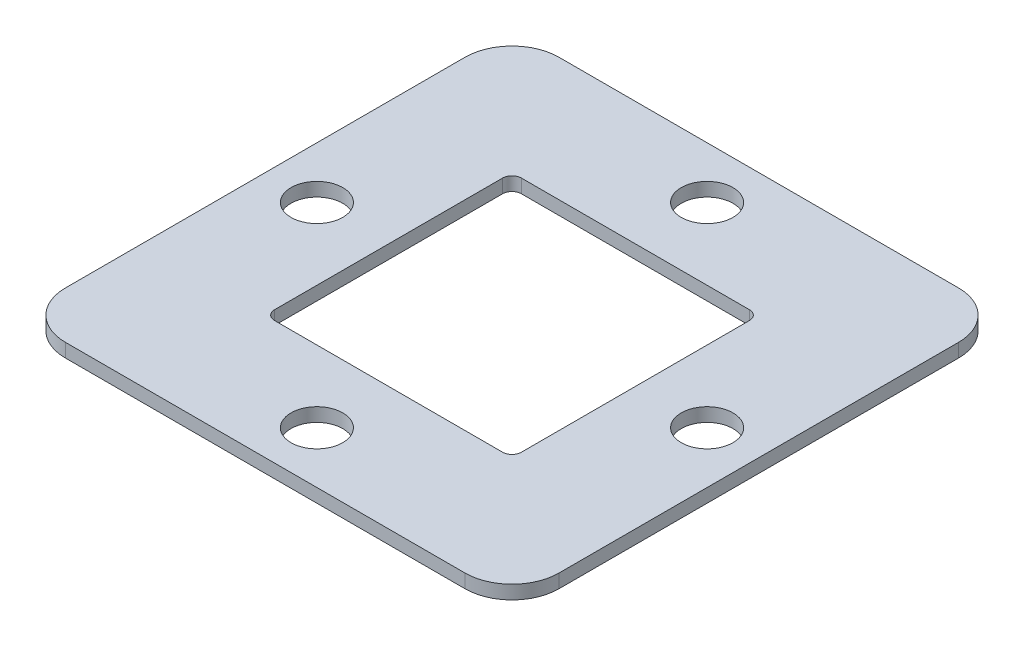
ISO-10303-21;
HEADER;
FILE_DESCRIPTION(('STEP AP214'),'2;1');
FILE_NAME('part.step','',(''),(''),'','','');
FILE_SCHEMA(('AUTOMOTIVE_DESIGN { 1 0 10303 214 1 1 1 1 }'));
ENDSEC;
DATA;
#1=APPLICATION_CONTEXT('core data for automotive mechanical design processes');
#2=APPLICATION_PROTOCOL_DEFINITION('international standard','automotive_design',2000,#1);
#3=PRODUCT_CONTEXT('',#1,'mechanical');
#4=PRODUCT('Part','Part','',(#3));
#5=PRODUCT_RELATED_PRODUCT_CATEGORY('part','',(#4));
#6=PRODUCT_DEFINITION_FORMATION('','',#4);
#7=PRODUCT_DEFINITION_CONTEXT('part definition',#1,'design');
#8=PRODUCT_DEFINITION('design','',#6,#7);
#9=PRODUCT_DEFINITION_SHAPE('','',#8);
#10=(LENGTH_UNIT() NAMED_UNIT(*) SI_UNIT(.MILLI.,.METRE.));
#11=(NAMED_UNIT(*) PLANE_ANGLE_UNIT() SI_UNIT($,.RADIAN.));
#12=(NAMED_UNIT(*) SI_UNIT($,.STERADIAN.) SOLID_ANGLE_UNIT());
#13=UNCERTAINTY_MEASURE_WITH_UNIT(LENGTH_MEASURE(1.E-05),#10,'distance_accuracy_value','');
#14=(GEOMETRIC_REPRESENTATION_CONTEXT(3) GLOBAL_UNCERTAINTY_ASSIGNED_CONTEXT((#13)) GLOBAL_UNIT_ASSIGNED_CONTEXT((#10,
#11,#12)) REPRESENTATION_CONTEXT('',''));
#15=CARTESIAN_POINT('',(0.,0.,0.));
#16=DIRECTION('',(0.,0.,1.));
#17=DIRECTION('',(1.,0.,0.));
#18=AXIS2_PLACEMENT_3D('',#15,#16,#17);
#19=CARTESIAN_POINT('',(10.5,0.58,-10.5));
#20=DIRECTION('',(-1.,0.,0.));
#21=DIRECTION('',(0.,0.,1.));
#22=AXIS2_PLACEMENT_3D('',#19,#20,#21);
#23=PLANE('',#22);
#24=DIRECTION('',(0.,0.,-1.));
#25=VECTOR('',#24,1.);
#26=CARTESIAN_POINT('',(10.5,0.,-10.5));
#27=LINE('',#26,#25);
#28=CARTESIAN_POINT('',(10.5,0.,8.5));
#29=VERTEX_POINT('',#28);
#30=CARTESIAN_POINT('',(10.5,0.,-8.5));
#31=VERTEX_POINT('',#30);
#32=EDGE_CURVE('E271',#29,#31,#27,.T.);
#33=ORIENTED_EDGE('',*,*,#32,.T.);
#34=DIRECTION('',(0.,-1.,0.));
#35=VECTOR('',#34,1.);
#36=CARTESIAN_POINT('',(10.5,0.58,-8.5));
#37=LINE('',#36,#35);
#38=CARTESIAN_POINT('',(10.5,0.58,-8.5));
#39=VERTEX_POINT('',#38);
#40=EDGE_CURVE('E213',#31,#39,#37,.F.);
#41=ORIENTED_EDGE('',*,*,#40,.T.);
#42=DIRECTION('',(0.,0.,-1.));
#43=VECTOR('',#42,1.);
#44=CARTESIAN_POINT('',(10.5,0.58,-10.5));
#45=LINE('',#44,#43);
#46=CARTESIAN_POINT('',(10.5,0.58,8.5));
#47=VERTEX_POINT('',#46);
#48=EDGE_CURVE('E179',#47,#39,#45,.T.);
#49=ORIENTED_EDGE('',*,*,#48,.F.);
#50=DIRECTION('',(0.,-1.,0.));
#51=VECTOR('',#50,1.);
#52=CARTESIAN_POINT('',(10.5,0.58,8.5));
#53=LINE('',#52,#51);
#54=EDGE_CURVE('E210',#47,#29,#53,.T.);
#55=ORIENTED_EDGE('',*,*,#54,.T.);
#56=EDGE_LOOP('',(#33,#41,#49,#55));
#57=FACE_BOUND('',#56,.T.);
#58=ADVANCED_FACE('F39',(#57),#23,.F.);
#59=CARTESIAN_POINT('',(-10.5,0.58,-10.5));
#60=DIRECTION('',(0.,0.,1.));
#61=DIRECTION('',(1.,0.,0.));
#62=AXIS2_PLACEMENT_3D('',#59,#60,#61);
#63=PLANE('',#62);
#64=DIRECTION('',(-1.,0.,0.));
#65=VECTOR('',#64,1.);
#66=CARTESIAN_POINT('',(-10.5,0.,-10.5));
#67=LINE('',#66,#65);
#68=CARTESIAN_POINT('',(8.49999999999999,0.,-10.5));
#69=VERTEX_POINT('',#68);
#70=CARTESIAN_POINT('',(-8.5,0.,-10.5));
#71=VERTEX_POINT('',#70);
#72=EDGE_CURVE('E185',#69,#71,#67,.T.);
#73=ORIENTED_EDGE('',*,*,#72,.T.);
#74=DIRECTION('',(0.,-1.,0.));
#75=VECTOR('',#74,1.);
#76=CARTESIAN_POINT('',(-8.5,0.58,-10.5));
#77=LINE('',#76,#75);
#78=CARTESIAN_POINT('',(-8.5,0.58,-10.5));
#79=VERTEX_POINT('',#78);
#80=EDGE_CURVE('E208',#71,#79,#77,.F.);
#81=ORIENTED_EDGE('',*,*,#80,.T.);
#82=DIRECTION('',(-1.,0.,0.));
#83=VECTOR('',#82,1.);
#84=CARTESIAN_POINT('',(-10.5,0.58,-10.5));
#85=LINE('',#84,#83);
#86=CARTESIAN_POINT('',(8.49999999999999,0.58,-10.5));
#87=VERTEX_POINT('',#86);
#88=EDGE_CURVE('E183',#87,#79,#85,.T.);
#89=ORIENTED_EDGE('',*,*,#88,.F.);
#90=DIRECTION('',(0.,-1.,0.));
#91=VECTOR('',#90,1.);
#92=CARTESIAN_POINT('',(8.5,0.58,-10.5));
#93=LINE('',#92,#91);
#94=EDGE_CURVE('E205',#87,#69,#93,.T.);
#95=ORIENTED_EDGE('',*,*,#94,.T.);
#96=EDGE_LOOP('',(#73,#81,#89,#95));
#97=FACE_BOUND('',#96,.T.);
#98=ADVANCED_FACE('F295',(#97),#63,.F.);
#99=CARTESIAN_POINT('',(-10.5,0.58,-10.5));
#100=DIRECTION('',(1.,0.,0.));
#101=DIRECTION('',(0.,0.,-1.));
#102=AXIS2_PLACEMENT_3D('',#99,#100,#101);
#103=PLANE('',#102);
#104=DIRECTION('',(0.,0.,1.));
#105=VECTOR('',#104,1.);
#106=CARTESIAN_POINT('',(-10.5,0.,-10.5));
#107=LINE('',#106,#105);
#108=CARTESIAN_POINT('',(-10.5,0.,-8.5));
#109=VERTEX_POINT('',#108);
#110=CARTESIAN_POINT('',(-10.5,0.,8.5));
#111=VERTEX_POINT('',#110);
#112=EDGE_CURVE('E180',#109,#111,#107,.T.);
#113=ORIENTED_EDGE('',*,*,#112,.T.);
#114=DIRECTION('',(0.,-1.,0.));
#115=VECTOR('',#114,1.);
#116=CARTESIAN_POINT('',(-10.5,0.58,8.5));
#117=LINE('',#116,#115);
#118=CARTESIAN_POINT('',(-10.5,0.58,8.5));
#119=VERTEX_POINT('',#118);
#120=EDGE_CURVE('E158',#111,#119,#117,.F.);
#121=ORIENTED_EDGE('',*,*,#120,.T.);
#122=DIRECTION('',(0.,0.,1.));
#123=VECTOR('',#122,1.);
#124=CARTESIAN_POINT('',(-10.5,0.58,-10.5));
#125=LINE('',#124,#123);
#126=CARTESIAN_POINT('',(-10.5,0.58,-8.5));
#127=VERTEX_POINT('',#126);
#128=EDGE_CURVE('E286',#127,#119,#125,.T.);
#129=ORIENTED_EDGE('',*,*,#128,.F.);
#130=DIRECTION('',(0.,-1.,0.));
#131=VECTOR('',#130,1.);
#132=CARTESIAN_POINT('',(-10.5,0.58,-8.5));
#133=LINE('',#132,#131);
#134=EDGE_CURVE('E163',#127,#109,#133,.T.);
#135=ORIENTED_EDGE('',*,*,#134,.T.);
#136=EDGE_LOOP('',(#113,#121,#129,#135));
#137=FACE_BOUND('',#136,.T.);
#138=ADVANCED_FACE('F304',(#137),#103,.F.);
#139=CARTESIAN_POINT('',(-10.5,0.58,10.5));
#140=DIRECTION('',(0.,0.,-1.));
#141=DIRECTION('',(-1.,0.,0.));
#142=AXIS2_PLACEMENT_3D('',#139,#140,#141);
#143=PLANE('',#142);
#144=DIRECTION('',(1.,0.,0.));
#145=VECTOR('',#144,1.);
#146=CARTESIAN_POINT('',(-10.5,0.58,10.5));
#147=LINE('',#146,#145);
#148=CARTESIAN_POINT('',(-8.5,0.58,10.5));
#149=VERTEX_POINT('',#148);
#150=CARTESIAN_POINT('',(8.5,0.58,10.5));
#151=VERTEX_POINT('',#150);
#152=EDGE_CURVE('E173',#149,#151,#147,.T.);
#153=ORIENTED_EDGE('',*,*,#152,.F.);
#154=DIRECTION('',(0.,-1.,0.));
#155=VECTOR('',#154,1.);
#156=CARTESIAN_POINT('',(-8.5,0.58,10.5));
#157=LINE('',#156,#155);
#158=CARTESIAN_POINT('',(-8.5,0.,10.5));
#159=VERTEX_POINT('',#158);
#160=EDGE_CURVE('E157',#149,#159,#157,.T.);
#161=ORIENTED_EDGE('',*,*,#160,.T.);
#162=DIRECTION('',(1.,0.,0.));
#163=VECTOR('',#162,1.);
#164=CARTESIAN_POINT('',(-10.5,0.,10.5));
#165=LINE('',#164,#163);
#166=CARTESIAN_POINT('',(8.5,0.,10.5));
#167=VERTEX_POINT('',#166);
#168=EDGE_CURVE('E170',#159,#167,#165,.T.);
#169=ORIENTED_EDGE('',*,*,#168,.T.);
#170=DIRECTION('',(0.,-1.,0.));
#171=VECTOR('',#170,1.);
#172=CARTESIAN_POINT('',(8.5,0.58,10.5));
#173=LINE('',#172,#171);
#174=EDGE_CURVE('E175',#167,#151,#173,.F.);
#175=ORIENTED_EDGE('',*,*,#174,.T.);
#176=EDGE_LOOP('',(#153,#161,#169,#175));
#177=FACE_BOUND('',#176,.T.);
#178=ADVANCED_FACE('F169',(#177),#143,.F.);
#179=CARTESIAN_POINT('',(0.,0.58,0.));
#180=DIRECTION('',(0.,1.,0.));
#181=DIRECTION('',(0.,0.,1.));
#182=AXIS2_PLACEMENT_3D('',#179,#180,#181);
#183=PLANE('',#182);
#184=CARTESIAN_POINT('',(0.,0.58,-8.30000000000001));
#185=DIRECTION('',(0.,1.,0.));
#186=DIRECTION('',(0.,0.,1.));
#187=AXIS2_PLACEMENT_3D('',#184,#185,#186);
#188=CIRCLE('',#187,1.1);
#189=CARTESIAN_POINT('',(0.,0.58,-7.20000000000001));
#190=VERTEX_POINT('',#189);
#191=EDGE_CURVE('E377',#190,#190,#188,.T.);
#192=ORIENTED_EDGE('',*,*,#191,.F.);
#193=EDGE_LOOP('',(#192));
#194=FACE_BOUND('',#193,.T.);
#195=CARTESIAN_POINT('',(8.30000000000001,0.58,0.));
#196=DIRECTION('',(0.,1.,0.));
#197=DIRECTION('',(0.,0.,1.));
#198=AXIS2_PLACEMENT_3D('',#195,#196,#197);
#199=CIRCLE('',#198,1.1);
#200=CARTESIAN_POINT('',(8.30000000000001,0.58,1.1));
#201=VERTEX_POINT('',#200);
#202=EDGE_CURVE('E374',#201,#201,#199,.T.);
#203=ORIENTED_EDGE('',*,*,#202,.F.);
#204=EDGE_LOOP('',(#203));
#205=FACE_BOUND('',#204,.T.);
#206=CARTESIAN_POINT('',(0.,0.58,8.30000000000001));
#207=DIRECTION('',(0.,1.,0.));
#208=DIRECTION('',(0.,0.,1.));
#209=AXIS2_PLACEMENT_3D('',#206,#207,#208);
#210=CIRCLE('',#209,1.1);
#211=CARTESIAN_POINT('',(0.,0.58,9.40000000000001));
#212=VERTEX_POINT('',#211);
#213=EDGE_CURVE('E368',#212,#212,#210,.T.);
#214=ORIENTED_EDGE('',*,*,#213,.F.);
#215=EDGE_LOOP('',(#214));
#216=FACE_BOUND('',#215,.T.);
#217=CARTESIAN_POINT('',(-8.30000000000001,0.58,0.));
#218=DIRECTION('',(0.,1.,0.));
#219=DIRECTION('',(0.,0.,1.));
#220=AXIS2_PLACEMENT_3D('',#217,#218,#219);
#221=CIRCLE('',#220,1.1);
#222=CARTESIAN_POINT('',(-8.30000000000001,0.58,1.1));
#223=VERTEX_POINT('',#222);
#224=EDGE_CURVE('E362',#223,#223,#221,.T.);
#225=ORIENTED_EDGE('',*,*,#224,.F.);
#226=EDGE_LOOP('',(#225));
#227=FACE_BOUND('',#226,.T.);
#228=DIRECTION('',(0.,0.,-1.));
#229=VECTOR('',#228,1.);
#230=CARTESIAN_POINT('',(5.25,0.58,-5.25));
#231=LINE('',#230,#229);
#232=CARTESIAN_POINT('',(5.25,0.58,4.85));
#233=VERTEX_POINT('',#232);
#234=CARTESIAN_POINT('',(5.25,0.58,-4.85));
#235=VERTEX_POINT('',#234);
#236=EDGE_CURVE('E257',#233,#235,#231,.T.);
#237=ORIENTED_EDGE('',*,*,#236,.F.);
#238=CARTESIAN_POINT('',(4.85,0.58,4.85));
#239=DIRECTION('',(0.,1.,0.));
#240=DIRECTION('',(0.,0.,1.));
#241=AXIS2_PLACEMENT_3D('',#238,#239,#240);
#242=CIRCLE('',#241,0.4);
#243=CARTESIAN_POINT('',(4.85,0.58,5.25));
#244=VERTEX_POINT('',#243);
#245=EDGE_CURVE('E238',#233,#244,#242,.F.);
#246=ORIENTED_EDGE('',*,*,#245,.T.);
#247=DIRECTION('',(1.,0.,0.));
#248=VECTOR('',#247,1.);
#249=CARTESIAN_POINT('',(-5.25,0.58,5.25));
#250=LINE('',#249,#248);
#251=CARTESIAN_POINT('',(-4.85,0.58,5.25));
#252=VERTEX_POINT('',#251);
#253=EDGE_CURVE('E281',#252,#244,#250,.T.);
#254=ORIENTED_EDGE('',*,*,#253,.F.);
#255=CARTESIAN_POINT('',(-4.85,0.58,4.85));
#256=DIRECTION('',(0.,1.,0.));
#257=DIRECTION('',(0.,0.,1.));
#258=AXIS2_PLACEMENT_3D('',#255,#256,#257);
#259=CIRCLE('',#258,0.4);
#260=CARTESIAN_POINT('',(-5.25,0.58,4.85));
#261=VERTEX_POINT('',#260);
#262=EDGE_CURVE('E234',#252,#261,#259,.F.);
#263=ORIENTED_EDGE('',*,*,#262,.T.);
#264=DIRECTION('',(0.,0.,1.));
#265=VECTOR('',#264,1.);
#266=CARTESIAN_POINT('',(-5.25,0.58,-5.25));
#267=LINE('',#266,#265);
#268=CARTESIAN_POINT('',(-5.25,0.58,-4.85));
#269=VERTEX_POINT('',#268);
#270=EDGE_CURVE('E252',#269,#261,#267,.T.);
#271=ORIENTED_EDGE('',*,*,#270,.F.);
#272=CARTESIAN_POINT('',(-4.85,0.58,-4.85));
#273=DIRECTION('',(0.,1.,0.));
#274=DIRECTION('',(0.,0.,1.));
#275=AXIS2_PLACEMENT_3D('',#272,#273,#274);
#276=CIRCLE('',#275,0.4);
#277=CARTESIAN_POINT('',(-4.85,0.58,-5.25));
#278=VERTEX_POINT('',#277);
#279=EDGE_CURVE('E47',#269,#278,#276,.F.);
#280=ORIENTED_EDGE('',*,*,#279,.T.);
#281=DIRECTION('',(-1.,0.,0.));
#282=VECTOR('',#281,1.);
#283=CARTESIAN_POINT('',(-5.25,0.58,-5.25));
#284=LINE('',#283,#282);
#285=CARTESIAN_POINT('',(4.85,0.58,-5.25));
#286=VERTEX_POINT('',#285);
#287=EDGE_CURVE('E250',#286,#278,#284,.T.);
#288=ORIENTED_EDGE('',*,*,#287,.F.);
#289=CARTESIAN_POINT('',(4.85,0.58,-4.85));
#290=DIRECTION('',(0.,1.,0.));
#291=DIRECTION('',(0.,0.,1.));
#292=AXIS2_PLACEMENT_3D('',#289,#290,#291);
#293=CIRCLE('',#292,0.4);
#294=EDGE_CURVE('E242',#286,#235,#293,.F.);
#295=ORIENTED_EDGE('',*,*,#294,.T.);
#296=EDGE_LOOP('',(#237,#246,#254,#263,#271,#280,#288,#295));
#297=FACE_BOUND('',#296,.T.);
#298=ORIENTED_EDGE('',*,*,#128,.T.);
#299=CARTESIAN_POINT('',(-8.5,0.58,8.5));
#300=DIRECTION('',(0.,1.,0.));
#301=DIRECTION('',(0.,0.,1.));
#302=AXIS2_PLACEMENT_3D('',#299,#300,#301);
#303=CIRCLE('',#302,2.);
#304=EDGE_CURVE('E203',#119,#149,#303,.T.);
#305=ORIENTED_EDGE('',*,*,#304,.T.);
#306=ORIENTED_EDGE('',*,*,#152,.T.);
#307=CARTESIAN_POINT('',(8.5,0.58,8.5));
#308=DIRECTION('',(0.,1.,0.));
#309=DIRECTION('',(0.,0.,1.));
#310=AXIS2_PLACEMENT_3D('',#307,#308,#309);
#311=CIRCLE('',#310,2.);
#312=EDGE_CURVE('E197',#151,#47,#311,.T.);
#313=ORIENTED_EDGE('',*,*,#312,.T.);
#314=ORIENTED_EDGE('',*,*,#48,.T.);
#315=CARTESIAN_POINT('',(8.5,0.58,-8.5));
#316=DIRECTION('',(0.,1.,0.));
#317=DIRECTION('',(0.,0.,1.));
#318=AXIS2_PLACEMENT_3D('',#315,#316,#317);
#319=CIRCLE('',#318,2.);
#320=EDGE_CURVE('E199',#39,#87,#319,.T.);
#321=ORIENTED_EDGE('',*,*,#320,.T.);
#322=ORIENTED_EDGE('',*,*,#88,.T.);
#323=CARTESIAN_POINT('',(-8.5,0.58,-8.5));
#324=DIRECTION('',(0.,1.,0.));
#325=DIRECTION('',(0.,0.,1.));
#326=AXIS2_PLACEMENT_3D('',#323,#324,#325);
#327=CIRCLE('',#326,2.);
#328=EDGE_CURVE('E201',#79,#127,#327,.T.);
#329=ORIENTED_EDGE('',*,*,#328,.T.);
#330=EDGE_LOOP('',(#298,#305,#306,#313,#314,#321,#322,#329));
#331=FACE_BOUND('',#330,.T.);
#332=ADVANCED_FACE('F248',(#194,#205,#216,#227,#297,#331),#183,.T.);
#333=CARTESIAN_POINT('',(0.,0.,0.));
#334=DIRECTION('',(0.,1.,0.));
#335=DIRECTION('',(0.,0.,1.));
#336=AXIS2_PLACEMENT_3D('',#333,#334,#335);
#337=PLANE('',#336);
#338=CARTESIAN_POINT('',(0.,0.,-8.30000000000001));
#339=DIRECTION('',(0.,1.,0.));
#340=DIRECTION('',(0.,0.,1.));
#341=AXIS2_PLACEMENT_3D('',#338,#339,#340);
#342=CIRCLE('',#341,1.1);
#343=CARTESIAN_POINT('',(0.,0.,-7.20000000000001));
#344=VERTEX_POINT('',#343);
#345=EDGE_CURVE('E278',#344,#344,#342,.T.);
#346=ORIENTED_EDGE('',*,*,#345,.T.);
#347=EDGE_LOOP('',(#346));
#348=FACE_BOUND('',#347,.T.);
#349=CARTESIAN_POINT('',(8.30000000000001,0.,0.));
#350=DIRECTION('',(0.,1.,0.));
#351=DIRECTION('',(0.,0.,1.));
#352=AXIS2_PLACEMENT_3D('',#349,#350,#351);
#353=CIRCLE('',#352,1.1);
#354=CARTESIAN_POINT('',(8.30000000000001,0.,1.1));
#355=VERTEX_POINT('',#354);
#356=EDGE_CURVE('E371',#355,#355,#353,.T.);
#357=ORIENTED_EDGE('',*,*,#356,.T.);
#358=EDGE_LOOP('',(#357));
#359=FACE_BOUND('',#358,.T.);
#360=CARTESIAN_POINT('',(0.,0.,8.30000000000001));
#361=DIRECTION('',(0.,1.,0.));
#362=DIRECTION('',(0.,0.,1.));
#363=AXIS2_PLACEMENT_3D('',#360,#361,#362);
#364=CIRCLE('',#363,1.1);
#365=CARTESIAN_POINT('',(0.,0.,9.40000000000001));
#366=VERTEX_POINT('',#365);
#367=EDGE_CURVE('E365',#366,#366,#364,.T.);
#368=ORIENTED_EDGE('',*,*,#367,.T.);
#369=EDGE_LOOP('',(#368));
#370=FACE_BOUND('',#369,.T.);
#371=CARTESIAN_POINT('',(-8.30000000000001,0.,0.));
#372=DIRECTION('',(0.,1.,0.));
#373=DIRECTION('',(0.,0.,1.));
#374=AXIS2_PLACEMENT_3D('',#371,#372,#373);
#375=CIRCLE('',#374,1.1);
#376=CARTESIAN_POINT('',(-8.30000000000001,0.,1.1));
#377=VERTEX_POINT('',#376);
#378=EDGE_CURVE('E359',#377,#377,#375,.T.);
#379=ORIENTED_EDGE('',*,*,#378,.T.);
#380=EDGE_LOOP('',(#379));
#381=FACE_BOUND('',#380,.T.);
#382=DIRECTION('',(0.,0.,1.));
#383=VECTOR('',#382,1.);
#384=CARTESIAN_POINT('',(-5.25,0.,-5.25));
#385=LINE('',#384,#383);
#386=CARTESIAN_POINT('',(-5.25,0.,-4.85));
#387=VERTEX_POINT('',#386);
#388=CARTESIAN_POINT('',(-5.25,0.,4.85));
#389=VERTEX_POINT('',#388);
#390=EDGE_CURVE('E262',#387,#389,#385,.T.);
#391=ORIENTED_EDGE('',*,*,#390,.T.);
#392=CARTESIAN_POINT('',(-4.85,0.,4.85));
#393=DIRECTION('',(0.,1.,0.));
#394=DIRECTION('',(0.,0.,1.));
#395=AXIS2_PLACEMENT_3D('',#392,#393,#394);
#396=CIRCLE('',#395,0.4);
#397=CARTESIAN_POINT('',(-4.85,0.,5.25));
#398=VERTEX_POINT('',#397);
#399=EDGE_CURVE('E236',#389,#398,#396,.T.);
#400=ORIENTED_EDGE('',*,*,#399,.T.);
#401=DIRECTION('',(1.,0.,0.));
#402=VECTOR('',#401,1.);
#403=CARTESIAN_POINT('',(-5.25,0.,5.25));
#404=LINE('',#403,#402);
#405=CARTESIAN_POINT('',(4.85,0.,5.25));
#406=VERTEX_POINT('',#405);
#407=EDGE_CURVE('E268',#398,#406,#404,.T.);
#408=ORIENTED_EDGE('',*,*,#407,.T.);
#409=CARTESIAN_POINT('',(4.85,0.,4.85));
#410=DIRECTION('',(0.,1.,0.));
#411=DIRECTION('',(0.,0.,1.));
#412=AXIS2_PLACEMENT_3D('',#409,#410,#411);
#413=CIRCLE('',#412,0.4);
#414=CARTESIAN_POINT('',(5.25,0.,4.85));
#415=VERTEX_POINT('',#414);
#416=EDGE_CURVE('E240',#406,#415,#413,.T.);
#417=ORIENTED_EDGE('',*,*,#416,.T.);
#418=DIRECTION('',(0.,0.,-1.));
#419=VECTOR('',#418,1.);
#420=CARTESIAN_POINT('',(5.25,0.,-5.25));
#421=LINE('',#420,#419);
#422=CARTESIAN_POINT('',(5.25,0.,-4.85));
#423=VERTEX_POINT('',#422);
#424=EDGE_CURVE('E273',#415,#423,#421,.T.);
#425=ORIENTED_EDGE('',*,*,#424,.T.);
#426=CARTESIAN_POINT('',(4.85,0.,-4.85));
#427=DIRECTION('',(0.,1.,0.));
#428=DIRECTION('',(0.,0.,1.));
#429=AXIS2_PLACEMENT_3D('',#426,#427,#428);
#430=CIRCLE('',#429,0.4);
#431=CARTESIAN_POINT('',(4.85,0.,-5.25));
#432=VERTEX_POINT('',#431);
#433=EDGE_CURVE('E61',#423,#432,#430,.T.);
#434=ORIENTED_EDGE('',*,*,#433,.T.);
#435=DIRECTION('',(-1.,0.,0.));
#436=VECTOR('',#435,1.);
#437=CARTESIAN_POINT('',(-5.25,0.,-5.25));
#438=LINE('',#437,#436);
#439=CARTESIAN_POINT('',(-4.85,0.,-5.25));
#440=VERTEX_POINT('',#439);
#441=EDGE_CURVE('E264',#432,#440,#438,.T.);
#442=ORIENTED_EDGE('',*,*,#441,.T.);
#443=CARTESIAN_POINT('',(-4.85,0.,-4.85));
#444=DIRECTION('',(0.,1.,0.));
#445=DIRECTION('',(0.,0.,1.));
#446=AXIS2_PLACEMENT_3D('',#443,#444,#445);
#447=CIRCLE('',#446,0.4);
#448=EDGE_CURVE('E11',#440,#387,#447,.T.);
#449=ORIENTED_EDGE('',*,*,#448,.T.);
#450=EDGE_LOOP('',(#391,#400,#408,#417,#425,#434,#442,#449));
#451=FACE_BOUND('',#450,.T.);
#452=ORIENTED_EDGE('',*,*,#168,.F.);
#453=CARTESIAN_POINT('',(-8.5,0.,8.5));
#454=DIRECTION('',(0.,1.,0.));
#455=DIRECTION('',(0.,0.,1.));
#456=AXIS2_PLACEMENT_3D('',#453,#454,#455);
#457=CIRCLE('',#456,2.);
#458=EDGE_CURVE('E153',#159,#111,#457,.F.);
#459=ORIENTED_EDGE('',*,*,#458,.T.);
#460=ORIENTED_EDGE('',*,*,#112,.F.);
#461=CARTESIAN_POINT('',(-8.5,0.,-8.5));
#462=DIRECTION('',(0.,1.,0.));
#463=DIRECTION('',(0.,0.,1.));
#464=AXIS2_PLACEMENT_3D('',#461,#462,#463);
#465=CIRCLE('',#464,2.);
#466=EDGE_CURVE('E164',#109,#71,#465,.F.);
#467=ORIENTED_EDGE('',*,*,#466,.T.);
#468=ORIENTED_EDGE('',*,*,#72,.F.);
#469=CARTESIAN_POINT('',(8.5,0.,-8.5));
#470=DIRECTION('',(0.,1.,0.));
#471=DIRECTION('',(0.,0.,1.));
#472=AXIS2_PLACEMENT_3D('',#469,#470,#471);
#473=CIRCLE('',#472,2.);
#474=EDGE_CURVE('E191',#69,#31,#473,.F.);
#475=ORIENTED_EDGE('',*,*,#474,.T.);
#476=ORIENTED_EDGE('',*,*,#32,.F.);
#477=CARTESIAN_POINT('',(8.5,0.,8.5));
#478=DIRECTION('',(0.,1.,0.));
#479=DIRECTION('',(0.,0.,1.));
#480=AXIS2_PLACEMENT_3D('',#477,#478,#479);
#481=CIRCLE('',#480,2.);
#482=EDGE_CURVE('E174',#29,#167,#481,.F.);
#483=ORIENTED_EDGE('',*,*,#482,.T.);
#484=EDGE_LOOP('',(#452,#459,#460,#467,#468,#475,#476,#483));
#485=FACE_BOUND('',#484,.T.);
#486=ADVANCED_FACE('F177',(#348,#359,#370,#381,#451,#485),#337,.F.);
#487=CARTESIAN_POINT('',(5.25,0.,-5.25));
#488=DIRECTION('',(1.,0.,0.));
#489=DIRECTION('',(0.,0.,-1.));
#490=AXIS2_PLACEMENT_3D('',#487,#488,#489);
#491=PLANE('',#490);
#492=ORIENTED_EDGE('',*,*,#424,.F.);
#493=DIRECTION('',(0.,1.,0.));
#494=VECTOR('',#493,1.);
#495=CARTESIAN_POINT('',(5.25,0.58,4.85));
#496=LINE('',#495,#494);
#497=EDGE_CURVE('E227',#415,#233,#496,.T.);
#498=ORIENTED_EDGE('',*,*,#497,.T.);
#499=ORIENTED_EDGE('',*,*,#236,.T.);
#500=DIRECTION('',(0.,1.,0.));
#501=VECTOR('',#500,1.);
#502=CARTESIAN_POINT('',(5.25,0.,-4.85));
#503=LINE('',#502,#501);
#504=EDGE_CURVE('E225',#235,#423,#503,.F.);
#505=ORIENTED_EDGE('',*,*,#504,.T.);
#506=EDGE_LOOP('',(#492,#498,#499,#505));
#507=FACE_BOUND('',#506,.T.);
#508=ADVANCED_FACE('F349',(#507),#491,.F.);
#509=CARTESIAN_POINT('',(-5.25,0.,5.25));
#510=DIRECTION('',(0.,0.,1.));
#511=DIRECTION('',(1.,0.,0.));
#512=AXIS2_PLACEMENT_3D('',#509,#510,#511);
#513=PLANE('',#512);
#514=ORIENTED_EDGE('',*,*,#407,.F.);
#515=DIRECTION('',(0.,1.,0.));
#516=VECTOR('',#515,1.);
#517=CARTESIAN_POINT('',(-4.85,0.58,5.25));
#518=LINE('',#517,#516);
#519=EDGE_CURVE('E217',#398,#252,#518,.T.);
#520=ORIENTED_EDGE('',*,*,#519,.T.);
#521=ORIENTED_EDGE('',*,*,#253,.T.);
#522=DIRECTION('',(0.,1.,0.));
#523=VECTOR('',#522,1.);
#524=CARTESIAN_POINT('',(4.85,0.,5.25));
#525=LINE('',#524,#523);
#526=EDGE_CURVE('E215',#244,#406,#525,.F.);
#527=ORIENTED_EDGE('',*,*,#526,.T.);
#528=EDGE_LOOP('',(#514,#520,#521,#527));
#529=FACE_BOUND('',#528,.T.);
#530=ADVANCED_FACE('F356',(#529),#513,.F.);
#531=CARTESIAN_POINT('',(-5.25,0.,-5.25));
#532=DIRECTION('',(-1.,0.,0.));
#533=DIRECTION('',(0.,0.,1.));
#534=AXIS2_PLACEMENT_3D('',#531,#532,#533);
#535=PLANE('',#534);
#536=ORIENTED_EDGE('',*,*,#270,.T.);
#537=DIRECTION('',(0.,1.,0.));
#538=VECTOR('',#537,1.);
#539=CARTESIAN_POINT('',(-5.25,0.,4.85));
#540=LINE('',#539,#538);
#541=EDGE_CURVE('E223',#261,#389,#540,.F.);
#542=ORIENTED_EDGE('',*,*,#541,.T.);
#543=ORIENTED_EDGE('',*,*,#390,.F.);
#544=DIRECTION('',(0.,1.,0.));
#545=VECTOR('',#544,1.);
#546=CARTESIAN_POINT('',(-5.25,0.58,-4.85));
#547=LINE('',#546,#545);
#548=EDGE_CURVE('E220',#387,#269,#547,.T.);
#549=ORIENTED_EDGE('',*,*,#548,.T.);
#550=EDGE_LOOP('',(#536,#542,#543,#549));
#551=FACE_BOUND('',#550,.T.);
#552=ADVANCED_FACE('F266',(#551),#535,.F.);
#553=CARTESIAN_POINT('',(-5.25,0.,-5.25));
#554=DIRECTION('',(0.,0.,-1.));
#555=DIRECTION('',(-1.,0.,0.));
#556=AXIS2_PLACEMENT_3D('',#553,#554,#555);
#557=PLANE('',#556);
#558=ORIENTED_EDGE('',*,*,#441,.F.);
#559=DIRECTION('',(0.,1.,0.));
#560=VECTOR('',#559,1.);
#561=CARTESIAN_POINT('',(4.85,0.58,-5.25));
#562=LINE('',#561,#560);
#563=EDGE_CURVE('E231',#432,#286,#562,.T.);
#564=ORIENTED_EDGE('',*,*,#563,.T.);
#565=ORIENTED_EDGE('',*,*,#287,.T.);
#566=DIRECTION('',(0.,1.,0.));
#567=VECTOR('',#566,1.);
#568=CARTESIAN_POINT('',(-4.85,0.,-5.25));
#569=LINE('',#568,#567);
#570=EDGE_CURVE('E54',#278,#440,#569,.F.);
#571=ORIENTED_EDGE('',*,*,#570,.T.);
#572=EDGE_LOOP('',(#558,#564,#565,#571));
#573=FACE_BOUND('',#572,.T.);
#574=ADVANCED_FACE('F255',(#573),#557,.F.);
#575=CARTESIAN_POINT('',(-8.5,0.58,8.5));
#576=DIRECTION('',(0.,-1.,0.));
#577=DIRECTION('',(0.,0.,-1.));
#578=AXIS2_PLACEMENT_3D('',#575,#576,#577);
#579=CYLINDRICAL_SURFACE('',#578,2.);
#580=ORIENTED_EDGE('',*,*,#304,.F.);
#581=ORIENTED_EDGE('',*,*,#120,.F.);
#582=ORIENTED_EDGE('',*,*,#458,.F.);
#583=ORIENTED_EDGE('',*,*,#160,.F.);
#584=EDGE_LOOP('',(#580,#581,#582,#583));
#585=FACE_BOUND('',#584,.T.);
#586=ADVANCED_FACE('F156',(#585),#579,.T.);
#587=CARTESIAN_POINT('',(-8.5,0.58,-8.5));
#588=DIRECTION('',(0.,-1.,0.));
#589=DIRECTION('',(0.,0.,-1.));
#590=AXIS2_PLACEMENT_3D('',#587,#588,#589);
#591=CYLINDRICAL_SURFACE('',#590,2.);
#592=ORIENTED_EDGE('',*,*,#328,.F.);
#593=ORIENTED_EDGE('',*,*,#80,.F.);
#594=ORIENTED_EDGE('',*,*,#466,.F.);
#595=ORIENTED_EDGE('',*,*,#134,.F.);
#596=EDGE_LOOP('',(#592,#593,#594,#595));
#597=FACE_BOUND('',#596,.T.);
#598=ADVANCED_FACE('F300',(#597),#591,.T.);
#599=CARTESIAN_POINT('',(8.5,0.58,-8.5));
#600=DIRECTION('',(0.,-1.,0.));
#601=DIRECTION('',(0.,0.,-1.));
#602=AXIS2_PLACEMENT_3D('',#599,#600,#601);
#603=CYLINDRICAL_SURFACE('',#602,2.);
#604=ORIENTED_EDGE('',*,*,#320,.F.);
#605=ORIENTED_EDGE('',*,*,#40,.F.);
#606=ORIENTED_EDGE('',*,*,#474,.F.);
#607=ORIENTED_EDGE('',*,*,#94,.F.);
#608=EDGE_LOOP('',(#604,#605,#606,#607));
#609=FACE_BOUND('',#608,.T.);
#610=ADVANCED_FACE('F323',(#609),#603,.T.);
#611=CARTESIAN_POINT('',(8.5,0.58,8.5));
#612=DIRECTION('',(0.,-1.,0.));
#613=DIRECTION('',(0.,0.,-1.));
#614=AXIS2_PLACEMENT_3D('',#611,#612,#613);
#615=CYLINDRICAL_SURFACE('',#614,2.);
#616=ORIENTED_EDGE('',*,*,#312,.F.);
#617=ORIENTED_EDGE('',*,*,#174,.F.);
#618=ORIENTED_EDGE('',*,*,#482,.F.);
#619=ORIENTED_EDGE('',*,*,#54,.F.);
#620=EDGE_LOOP('',(#616,#617,#618,#619));
#621=FACE_BOUND('',#620,.T.);
#622=ADVANCED_FACE('F326',(#621),#615,.T.);
#623=CARTESIAN_POINT('',(-8.30000000000001,0.,0.));
#624=DIRECTION('',(0.,1.,0.));
#625=DIRECTION('',(0.,0.,1.));
#626=AXIS2_PLACEMENT_3D('',#623,#624,#625);
#627=CYLINDRICAL_SURFACE('',#626,1.1);
#628=ORIENTED_EDGE('',*,*,#378,.F.);
#629=EDGE_LOOP('',(#628));
#630=FACE_BOUND('',#629,.T.);
#631=ORIENTED_EDGE('',*,*,#224,.T.);
#632=EDGE_LOOP('',(#631));
#633=FACE_BOUND('',#632,.T.);
#634=ADVANCED_FACE('F330',(#630,#633),#627,.F.);
#635=CARTESIAN_POINT('',(0.,0.,8.30000000000001));
#636=DIRECTION('',(0.,1.,0.));
#637=DIRECTION('',(0.,0.,1.));
#638=AXIS2_PLACEMENT_3D('',#635,#636,#637);
#639=CYLINDRICAL_SURFACE('',#638,1.1);
#640=ORIENTED_EDGE('',*,*,#367,.F.);
#641=EDGE_LOOP('',(#640));
#642=FACE_BOUND('',#641,.T.);
#643=ORIENTED_EDGE('',*,*,#213,.T.);
#644=EDGE_LOOP('',(#643));
#645=FACE_BOUND('',#644,.T.);
#646=ADVANCED_FACE('F401',(#642,#645),#639,.F.);
#647=CARTESIAN_POINT('',(8.30000000000001,0.,0.));
#648=DIRECTION('',(0.,1.,0.));
#649=DIRECTION('',(0.,0.,1.));
#650=AXIS2_PLACEMENT_3D('',#647,#648,#649);
#651=CYLINDRICAL_SURFACE('',#650,1.1);
#652=ORIENTED_EDGE('',*,*,#356,.F.);
#653=EDGE_LOOP('',(#652));
#654=FACE_BOUND('',#653,.T.);
#655=ORIENTED_EDGE('',*,*,#202,.T.);
#656=EDGE_LOOP('',(#655));
#657=FACE_BOUND('',#656,.T.);
#658=ADVANCED_FACE('F387',(#654,#657),#651,.F.);
#659=CARTESIAN_POINT('',(0.,0.,-8.30000000000001));
#660=DIRECTION('',(0.,1.,0.));
#661=DIRECTION('',(0.,0.,1.));
#662=AXIS2_PLACEMENT_3D('',#659,#660,#661);
#663=CYLINDRICAL_SURFACE('',#662,1.1);
#664=ORIENTED_EDGE('',*,*,#345,.F.);
#665=EDGE_LOOP('',(#664));
#666=FACE_BOUND('',#665,.T.);
#667=ORIENTED_EDGE('',*,*,#191,.T.);
#668=EDGE_LOOP('',(#667));
#669=FACE_BOUND('',#668,.T.);
#670=ADVANCED_FACE('F336',(#666,#669),#663,.F.);
#671=CARTESIAN_POINT('',(-4.85,0.,4.85));
#672=DIRECTION('',(0.,-1.,0.));
#673=DIRECTION('',(0.,0.,-1.));
#674=AXIS2_PLACEMENT_3D('',#671,#672,#673);
#675=CYLINDRICAL_SURFACE('',#674,0.4);
#676=ORIENTED_EDGE('',*,*,#399,.F.);
#677=ORIENTED_EDGE('',*,*,#541,.F.);
#678=ORIENTED_EDGE('',*,*,#262,.F.);
#679=ORIENTED_EDGE('',*,*,#519,.F.);
#680=EDGE_LOOP('',(#676,#677,#678,#679));
#681=FACE_BOUND('',#680,.T.);
#682=ADVANCED_FACE('F332',(#681),#675,.F.);
#683=CARTESIAN_POINT('',(4.85,0.,4.85));
#684=DIRECTION('',(0.,-1.,0.));
#685=DIRECTION('',(0.,0.,-1.));
#686=AXIS2_PLACEMENT_3D('',#683,#684,#685);
#687=CYLINDRICAL_SURFACE('',#686,0.4);
#688=ORIENTED_EDGE('',*,*,#416,.F.);
#689=ORIENTED_EDGE('',*,*,#526,.F.);
#690=ORIENTED_EDGE('',*,*,#245,.F.);
#691=ORIENTED_EDGE('',*,*,#497,.F.);
#692=EDGE_LOOP('',(#688,#689,#690,#691));
#693=FACE_BOUND('',#692,.T.);
#694=ADVANCED_FACE('F335',(#693),#687,.F.);
#695=CARTESIAN_POINT('',(4.85,0.,-4.85));
#696=DIRECTION('',(0.,-1.,0.));
#697=DIRECTION('',(0.,0.,-1.));
#698=AXIS2_PLACEMENT_3D('',#695,#696,#697);
#699=CYLINDRICAL_SURFACE('',#698,0.4);
#700=ORIENTED_EDGE('',*,*,#433,.F.);
#701=ORIENTED_EDGE('',*,*,#504,.F.);
#702=ORIENTED_EDGE('',*,*,#294,.F.);
#703=ORIENTED_EDGE('',*,*,#563,.F.);
#704=EDGE_LOOP('',(#700,#701,#702,#703));
#705=FACE_BOUND('',#704,.T.);
#706=ADVANCED_FACE('F339',(#705),#699,.F.);
#707=CARTESIAN_POINT('',(-4.85,0.,-4.85));
#708=DIRECTION('',(0.,-1.,0.));
#709=DIRECTION('',(0.,0.,-1.));
#710=AXIS2_PLACEMENT_3D('',#707,#708,#709);
#711=CYLINDRICAL_SURFACE('',#710,0.4);
#712=ORIENTED_EDGE('',*,*,#448,.F.);
#713=ORIENTED_EDGE('',*,*,#570,.F.);
#714=ORIENTED_EDGE('',*,*,#279,.F.);
#715=ORIENTED_EDGE('',*,*,#548,.F.);
#716=EDGE_LOOP('',(#712,#713,#714,#715));
#717=FACE_BOUND('',#716,.T.);
#718=ADVANCED_FACE('F41',(#717),#711,.F.);
#719=CLOSED_SHELL('',(#58,#98,#138,#178,#332,#486,#508,#530,#552,#574,#586,#598,#610,#622,#634,
#646,#658,#670,#682,#694,#706,#718));
#720=MANIFOLD_SOLID_BREP('B2',#719);
#721=ADVANCED_BREP_SHAPE_REPRESENTATION('',(#18,#720),#14);
#722=SHAPE_DEFINITION_REPRESENTATION(#9,#721);
ENDSEC;
END-ISO-10303-21;
